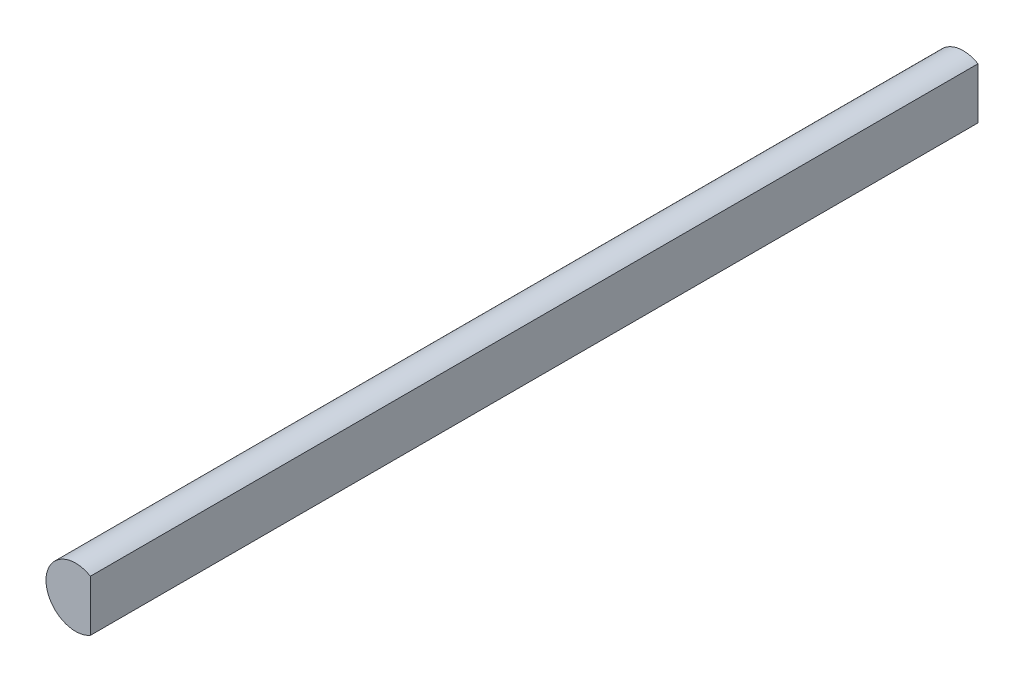
ISO-10303-21;
HEADER;
FILE_DESCRIPTION(('STEP AP214'),'2;1');
FILE_NAME('part.step','',(''),(''),'','','');
FILE_SCHEMA(('AUTOMOTIVE_DESIGN { 1 0 10303 214 1 1 1 1 }'));
ENDSEC;
DATA;
#1=APPLICATION_CONTEXT('core data for automotive mechanical design processes');
#2=APPLICATION_PROTOCOL_DEFINITION('international standard','automotive_design',2000,#1);
#3=PRODUCT_CONTEXT('',#1,'mechanical');
#4=PRODUCT('Part','Part','',(#3));
#5=PRODUCT_RELATED_PRODUCT_CATEGORY('part','',(#4));
#6=PRODUCT_DEFINITION_FORMATION('','',#4);
#7=PRODUCT_DEFINITION_CONTEXT('part definition',#1,'design');
#8=PRODUCT_DEFINITION('design','',#6,#7);
#9=PRODUCT_DEFINITION_SHAPE('','',#8);
#10=(LENGTH_UNIT() NAMED_UNIT(*) SI_UNIT(.MILLI.,.METRE.));
#11=(NAMED_UNIT(*) PLANE_ANGLE_UNIT() SI_UNIT($,.RADIAN.));
#12=(NAMED_UNIT(*) SI_UNIT($,.STERADIAN.) SOLID_ANGLE_UNIT());
#13=UNCERTAINTY_MEASURE_WITH_UNIT(LENGTH_MEASURE(1.E-05),#10,'distance_accuracy_value','');
#14=(GEOMETRIC_REPRESENTATION_CONTEXT(3) GLOBAL_UNCERTAINTY_ASSIGNED_CONTEXT((#13)) GLOBAL_UNIT_ASSIGNED_CONTEXT((#10,
#11,#12)) REPRESENTATION_CONTEXT('',''));
#15=CARTESIAN_POINT('',(0.,0.,0.));
#16=DIRECTION('',(0.,0.,1.));
#17=DIRECTION('',(1.,0.,0.));
#18=AXIS2_PLACEMENT_3D('',#15,#16,#17);
#19=CARTESIAN_POINT('',(0.,0.,30.));
#20=DIRECTION('',(0.,0.,-1.));
#21=DIRECTION('',(-1.,0.,0.));
#22=AXIS2_PLACEMENT_3D('',#19,#20,#21);
#23=CYLINDRICAL_SURFACE('',#22,2.);
#24=CARTESIAN_POINT('',(0.,0.,-30.));
#25=DIRECTION('',(0.,0.,1.));
#26=DIRECTION('',(1.,0.,0.));
#27=AXIS2_PLACEMENT_3D('',#24,#25,#26);
#28=CIRCLE('',#27,2.);
#29=CARTESIAN_POINT('',(1.,1.73205080756888,-30.));
#30=VERTEX_POINT('',#29);
#31=CARTESIAN_POINT('',(1.,-1.73205080756888,-30.));
#32=VERTEX_POINT('',#31);
#33=EDGE_CURVE('E66',#30,#32,#28,.T.);
#34=ORIENTED_EDGE('',*,*,#33,.T.);
#35=DIRECTION('',(0.,0.,-1.));
#36=VECTOR('',#35,1.);
#37=CARTESIAN_POINT('',(1.,-1.73205080756888,30.));
#38=LINE('',#37,#36);
#39=CARTESIAN_POINT('',(1.,-1.73205080756888,30.));
#40=VERTEX_POINT('',#39);
#41=EDGE_CURVE('E11',#40,#32,#38,.T.);
#42=ORIENTED_EDGE('',*,*,#41,.F.);
#43=CARTESIAN_POINT('',(0.,0.,30.));
#44=DIRECTION('',(0.,0.,1.));
#45=DIRECTION('',(1.,0.,0.));
#46=AXIS2_PLACEMENT_3D('',#43,#44,#45);
#47=CIRCLE('',#46,2.);
#48=CARTESIAN_POINT('',(1.,1.73205080756888,30.));
#49=VERTEX_POINT('',#48);
#50=EDGE_CURVE('E65',#49,#40,#47,.T.);
#51=ORIENTED_EDGE('',*,*,#50,.F.);
#52=DIRECTION('',(0.,0.,-1.));
#53=VECTOR('',#52,1.);
#54=CARTESIAN_POINT('',(1.,1.73205080756888,30.));
#55=LINE('',#54,#53);
#56=EDGE_CURVE('E43',#49,#30,#55,.T.);
#57=ORIENTED_EDGE('',*,*,#56,.T.);
#58=EDGE_LOOP('',(#34,#42,#51,#57));
#59=FACE_BOUND('',#58,.T.);
#60=ADVANCED_FACE('F35',(#59),#23,.T.);
#61=CARTESIAN_POINT('',(1.,1.73205080756888,30.));
#62=DIRECTION('',(-1.,0.,0.));
#63=DIRECTION('',(0.,0.,1.));
#64=AXIS2_PLACEMENT_3D('',#61,#62,#63);
#65=PLANE('',#64);
#66=DIRECTION('',(0.,1.,0.));
#67=VECTOR('',#66,1.);
#68=CARTESIAN_POINT('',(1.,1.73205080756888,-30.));
#69=LINE('',#68,#67);
#70=EDGE_CURVE('E58',#32,#30,#69,.T.);
#71=ORIENTED_EDGE('',*,*,#70,.T.);
#72=ORIENTED_EDGE('',*,*,#56,.F.);
#73=DIRECTION('',(0.,1.,0.));
#74=VECTOR('',#73,1.);
#75=CARTESIAN_POINT('',(1.,1.73205080756888,30.));
#76=LINE('',#75,#74);
#77=EDGE_CURVE('E50',#40,#49,#76,.T.);
#78=ORIENTED_EDGE('',*,*,#77,.F.);
#79=ORIENTED_EDGE('',*,*,#41,.T.);
#80=EDGE_LOOP('',(#71,#72,#78,#79));
#81=FACE_BOUND('',#80,.T.);
#82=ADVANCED_FACE('F61',(#81),#65,.F.);
#83=CARTESIAN_POINT('',(0.,0.,30.));
#84=DIRECTION('',(0.,0.,1.));
#85=DIRECTION('',(1.,0.,0.));
#86=AXIS2_PLACEMENT_3D('',#83,#84,#85);
#87=PLANE('',#86);
#88=ORIENTED_EDGE('',*,*,#50,.T.);
#89=ORIENTED_EDGE('',*,*,#77,.T.);
#90=EDGE_LOOP('',(#88,#89));
#91=FACE_BOUND('',#90,.T.);
#92=ADVANCED_FACE('F73',(#91),#87,.T.);
#93=CARTESIAN_POINT('',(0.,0.,-30.));
#94=DIRECTION('',(0.,0.,1.));
#95=DIRECTION('',(1.,0.,0.));
#96=AXIS2_PLACEMENT_3D('',#93,#94,#95);
#97=PLANE('',#96);
#98=ORIENTED_EDGE('',*,*,#33,.F.);
#99=ORIENTED_EDGE('',*,*,#70,.F.);
#100=EDGE_LOOP('',(#98,#99));
#101=FACE_BOUND('',#100,.T.);
#102=ADVANCED_FACE('F69',(#101),#97,.F.);
#103=CLOSED_SHELL('',(#60,#82,#92,#102));
#104=MANIFOLD_SOLID_BREP('B2',#103);
#105=ADVANCED_BREP_SHAPE_REPRESENTATION('',(#18,#104),#14);
#106=SHAPE_DEFINITION_REPRESENTATION(#9,#105);
ENDSEC;
END-ISO-10303-21;
